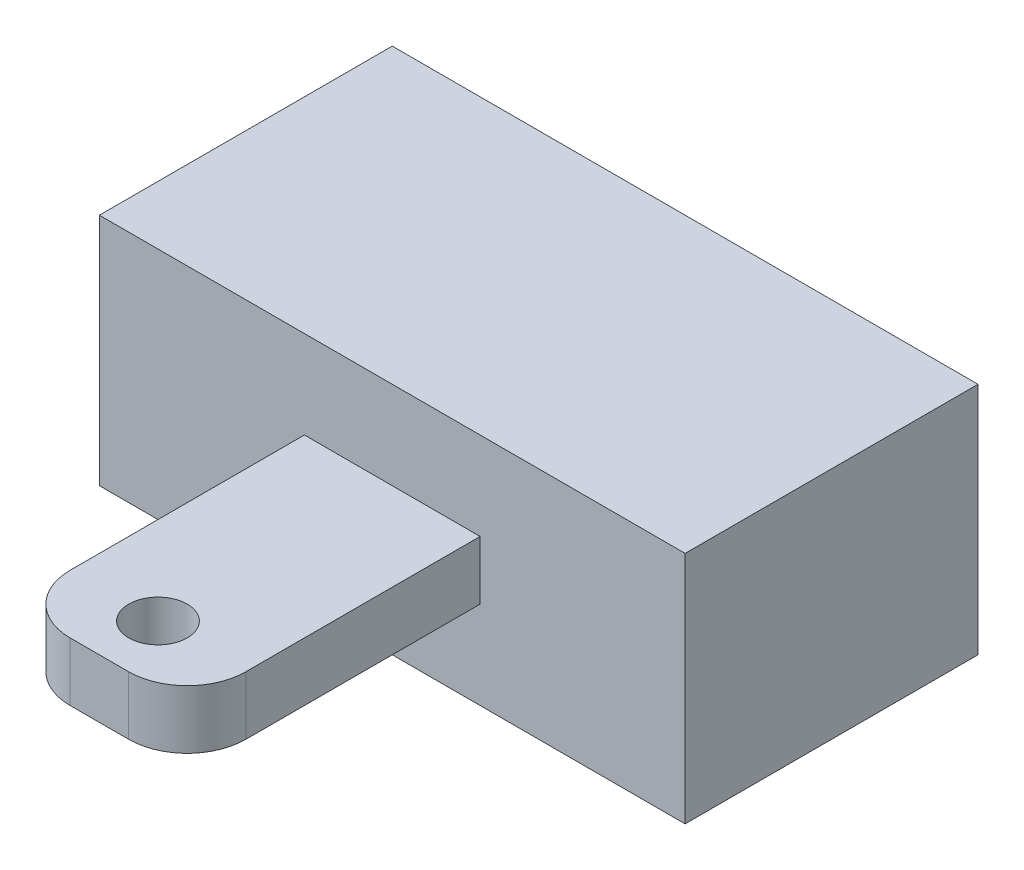
ISO-10303-21;
HEADER;
FILE_DESCRIPTION(('STEP AP214'),'2;1');
FILE_NAME('part.step','',(''),(''),'','','');
FILE_SCHEMA(('AUTOMOTIVE_DESIGN { 1 0 10303 214 1 1 1 1 }'));
ENDSEC;
DATA;
#1=APPLICATION_CONTEXT('core data for automotive mechanical design processes');
#2=APPLICATION_PROTOCOL_DEFINITION('international standard','automotive_design',2000,#1);
#3=PRODUCT_CONTEXT('',#1,'mechanical');
#4=PRODUCT('Part','Part','',(#3));
#5=PRODUCT_RELATED_PRODUCT_CATEGORY('part','',(#4));
#6=PRODUCT_DEFINITION_FORMATION('','',#4);
#7=PRODUCT_DEFINITION_CONTEXT('part definition',#1,'design');
#8=PRODUCT_DEFINITION('design','',#6,#7);
#9=PRODUCT_DEFINITION_SHAPE('','',#8);
#10=(LENGTH_UNIT() NAMED_UNIT(*) SI_UNIT(.MILLI.,.METRE.));
#11=(NAMED_UNIT(*) PLANE_ANGLE_UNIT() SI_UNIT($,.RADIAN.));
#12=(NAMED_UNIT(*) SI_UNIT($,.STERADIAN.) SOLID_ANGLE_UNIT());
#13=UNCERTAINTY_MEASURE_WITH_UNIT(LENGTH_MEASURE(1.E-05),#10,'distance_accuracy_value','');
#14=(GEOMETRIC_REPRESENTATION_CONTEXT(3) GLOBAL_UNCERTAINTY_ASSIGNED_CONTEXT((#13)) GLOBAL_UNIT_ASSIGNED_CONTEXT((#10,
#11,#12)) REPRESENTATION_CONTEXT('',''));
#15=CARTESIAN_POINT('',(0.,0.,0.));
#16=DIRECTION('',(0.,0.,1.));
#17=DIRECTION('',(1.,0.,0.));
#18=AXIS2_PLACEMENT_3D('',#15,#16,#17);
#19=CARTESIAN_POINT('',(15.,10.,50.));
#20=DIRECTION('',(-1.,0.,0.));
#21=DIRECTION('',(0.,0.,1.));
#22=AXIS2_PLACEMENT_3D('',#19,#20,#21);
#23=PLANE('',#22);
#24=DIRECTION('',(0.,0.,-1.));
#25=VECTOR('',#24,1.);
#26=CARTESIAN_POINT('',(15.,10.,50.));
#27=LINE('',#26,#25);
#28=CARTESIAN_POINT('',(15.,10.,40.));
#29=VERTEX_POINT('',#28);
#30=CARTESIAN_POINT('',(15.,10.,0.));
#31=VERTEX_POINT('',#30);
#32=EDGE_CURVE('E175',#29,#31,#27,.T.);
#33=ORIENTED_EDGE('',*,*,#32,.F.);
#34=DIRECTION('',(0.,-1.,0.));
#35=VECTOR('',#34,1.);
#36=CARTESIAN_POINT('',(15.,10.,40.));
#37=LINE('',#36,#35);
#38=CARTESIAN_POINT('',(15.,0.,40.));
#39=VERTEX_POINT('',#38);
#40=EDGE_CURVE('E189',#29,#39,#37,.T.);
#41=ORIENTED_EDGE('',*,*,#40,.T.);
#42=DIRECTION('',(0.,0.,-1.));
#43=VECTOR('',#42,1.);
#44=CARTESIAN_POINT('',(15.,0.,50.));
#45=LINE('',#44,#43);
#46=CARTESIAN_POINT('',(15.,0.,0.));
#47=VERTEX_POINT('',#46);
#48=EDGE_CURVE('E172',#39,#47,#45,.T.);
#49=ORIENTED_EDGE('',*,*,#48,.T.);
#50=DIRECTION('',(0.,1.,0.));
#51=VECTOR('',#50,1.);
#52=CARTESIAN_POINT('',(15.,10.,0.));
#53=LINE('',#52,#51);
#54=EDGE_CURVE('E163',#47,#31,#53,.T.);
#55=ORIENTED_EDGE('',*,*,#54,.T.);
#56=EDGE_LOOP('',(#33,#41,#49,#55));
#57=FACE_BOUND('',#56,.T.);
#58=ADVANCED_FACE('F38',(#57),#23,.F.);
#59=CARTESIAN_POINT('',(-15.,10.,50.));
#60=DIRECTION('',(1.,0.,0.));
#61=DIRECTION('',(0.,0.,-1.));
#62=AXIS2_PLACEMENT_3D('',#59,#60,#61);
#63=PLANE('',#62);
#64=DIRECTION('',(0.,0.,1.));
#65=VECTOR('',#64,1.);
#66=CARTESIAN_POINT('',(-15.,0.,50.));
#67=LINE('',#66,#65);
#68=CARTESIAN_POINT('',(-15.,0.,0.));
#69=VERTEX_POINT('',#68);
#70=CARTESIAN_POINT('',(-15.,0.,40.));
#71=VERTEX_POINT('',#70);
#72=EDGE_CURVE('E184',#69,#71,#67,.T.);
#73=ORIENTED_EDGE('',*,*,#72,.T.);
#74=DIRECTION('',(0.,-1.,0.));
#75=VECTOR('',#74,1.);
#76=CARTESIAN_POINT('',(-15.,10.,40.));
#77=LINE('',#76,#75);
#78=CARTESIAN_POINT('',(-15.,10.,40.));
#79=VERTEX_POINT('',#78);
#80=EDGE_CURVE('E11',#71,#79,#77,.F.);
#81=ORIENTED_EDGE('',*,*,#80,.T.);
#82=DIRECTION('',(0.,0.,1.));
#83=VECTOR('',#82,1.);
#84=CARTESIAN_POINT('',(-15.,10.,50.));
#85=LINE('',#84,#83);
#86=CARTESIAN_POINT('',(-15.,10.,0.));
#87=VERTEX_POINT('',#86);
#88=EDGE_CURVE('E177',#87,#79,#85,.T.);
#89=ORIENTED_EDGE('',*,*,#88,.F.);
#90=DIRECTION('',(0.,-1.,0.));
#91=VECTOR('',#90,1.);
#92=CARTESIAN_POINT('',(-15.,10.,0.));
#93=LINE('',#92,#91);
#94=EDGE_CURVE('E157',#87,#69,#93,.T.);
#95=ORIENTED_EDGE('',*,*,#94,.T.);
#96=EDGE_LOOP('',(#73,#81,#89,#95));
#97=FACE_BOUND('',#96,.T.);
#98=ADVANCED_FACE('F221',(#97),#63,.F.);
#99=CARTESIAN_POINT('',(-15.,10.,50.));
#100=DIRECTION('',(0.,0.,-1.));
#101=DIRECTION('',(-1.,0.,0.));
#102=AXIS2_PLACEMENT_3D('',#99,#100,#101);
#103=PLANE('',#102);
#104=DIRECTION('',(1.,0.,0.));
#105=VECTOR('',#104,1.);
#106=CARTESIAN_POINT('',(-15.,0.,50.));
#107=LINE('',#106,#105);
#108=CARTESIAN_POINT('',(-5.,0.,50.));
#109=VERTEX_POINT('',#108);
#110=CARTESIAN_POINT('',(5.,0.,50.));
#111=VERTEX_POINT('',#110);
#112=EDGE_CURVE('E178',#109,#111,#107,.T.);
#113=ORIENTED_EDGE('',*,*,#112,.T.);
#114=DIRECTION('',(0.,-1.,0.));
#115=VECTOR('',#114,1.);
#116=CARTESIAN_POINT('',(5.,10.,50.));
#117=LINE('',#116,#115);
#118=CARTESIAN_POINT('',(5.,10.,50.));
#119=VERTEX_POINT('',#118);
#120=EDGE_CURVE('E59',#111,#119,#117,.F.);
#121=ORIENTED_EDGE('',*,*,#120,.T.);
#122=DIRECTION('',(1.,0.,0.));
#123=VECTOR('',#122,1.);
#124=CARTESIAN_POINT('',(-15.,10.,50.));
#125=LINE('',#124,#123);
#126=CARTESIAN_POINT('',(-5.,10.,50.));
#127=VERTEX_POINT('',#126);
#128=EDGE_CURVE('E180',#127,#119,#125,.T.);
#129=ORIENTED_EDGE('',*,*,#128,.F.);
#130=DIRECTION('',(0.,-1.,0.));
#131=VECTOR('',#130,1.);
#132=CARTESIAN_POINT('',(-5.,10.,50.));
#133=LINE('',#132,#131);
#134=EDGE_CURVE('E196',#127,#109,#133,.T.);
#135=ORIENTED_EDGE('',*,*,#134,.T.);
#136=EDGE_LOOP('',(#113,#121,#129,#135));
#137=FACE_BOUND('',#136,.T.);
#138=ADVANCED_FACE('F217',(#137),#103,.F.);
#139=CARTESIAN_POINT('',(0.,10.,0.));
#140=DIRECTION('',(0.,-1.,0.));
#141=DIRECTION('',(0.,0.,-1.));
#142=AXIS2_PLACEMENT_3D('',#139,#140,#141);
#143=PLANE('',#142);
#144=CARTESIAN_POINT('',(0.,10.,40.));
#145=DIRECTION('',(0.,1.,0.));
#146=DIRECTION('',(0.,0.,1.));
#147=AXIS2_PLACEMENT_3D('',#144,#145,#146);
#148=CIRCLE('',#147,5.);
#149=CARTESIAN_POINT('',(0.,10.,45.));
#150=VERTEX_POINT('',#149);
#151=EDGE_CURVE('E168',#150,#150,#148,.T.);
#152=ORIENTED_EDGE('',*,*,#151,.F.);
#153=EDGE_LOOP('',(#152));
#154=FACE_BOUND('',#153,.T.);
#155=ORIENTED_EDGE('',*,*,#128,.T.);
#156=CARTESIAN_POINT('',(5.,10.,40.));
#157=DIRECTION('',(0.,-1.,0.));
#158=DIRECTION('',(0.,0.,-1.));
#159=AXIS2_PLACEMENT_3D('',#156,#157,#158);
#160=CIRCLE('',#159,10.);
#161=EDGE_CURVE('E46',#119,#29,#160,.F.);
#162=ORIENTED_EDGE('',*,*,#161,.T.);
#163=ORIENTED_EDGE('',*,*,#32,.T.);
#164=DIRECTION('',(-1.,0.,0.));
#165=VECTOR('',#164,1.);
#166=CARTESIAN_POINT('',(0.,10.,0.));
#167=LINE('',#166,#165);
#168=EDGE_CURVE('E166',#31,#87,#167,.T.);
#169=ORIENTED_EDGE('',*,*,#168,.T.);
#170=ORIENTED_EDGE('',*,*,#88,.T.);
#171=CARTESIAN_POINT('',(-5.,10.,40.));
#172=DIRECTION('',(0.,-1.,0.));
#173=DIRECTION('',(0.,0.,-1.));
#174=AXIS2_PLACEMENT_3D('',#171,#172,#173);
#175=CIRCLE('',#174,10.);
#176=EDGE_CURVE('E200',#79,#127,#175,.F.);
#177=ORIENTED_EDGE('',*,*,#176,.T.);
#178=EDGE_LOOP('',(#155,#162,#163,#169,#170,#177));
#179=FACE_BOUND('',#178,.T.);
#180=ADVANCED_FACE('F204',(#154,#179),#143,.F.);
#181=CARTESIAN_POINT('',(0.,0.,0.));
#182=DIRECTION('',(0.,-1.,0.));
#183=DIRECTION('',(0.,0.,-1.));
#184=AXIS2_PLACEMENT_3D('',#181,#182,#183);
#185=PLANE('',#184);
#186=ORIENTED_EDGE('',*,*,#48,.F.);
#187=CARTESIAN_POINT('',(5.,0.,40.));
#188=DIRECTION('',(0.,-1.,0.));
#189=DIRECTION('',(0.,0.,-1.));
#190=AXIS2_PLACEMENT_3D('',#187,#188,#189);
#191=CIRCLE('',#190,10.);
#192=EDGE_CURVE('E194',#39,#111,#191,.T.);
#193=ORIENTED_EDGE('',*,*,#192,.T.);
#194=ORIENTED_EDGE('',*,*,#112,.F.);
#195=CARTESIAN_POINT('',(-5.,0.,40.));
#196=DIRECTION('',(0.,-1.,0.));
#197=DIRECTION('',(0.,0.,-1.));
#198=AXIS2_PLACEMENT_3D('',#195,#196,#197);
#199=CIRCLE('',#198,10.);
#200=EDGE_CURVE('E192',#109,#71,#199,.T.);
#201=ORIENTED_EDGE('',*,*,#200,.T.);
#202=ORIENTED_EDGE('',*,*,#72,.F.);
#203=DIRECTION('',(-1.,0.,0.));
#204=VECTOR('',#203,1.);
#205=CARTESIAN_POINT('',(0.,0.,0.));
#206=LINE('',#205,#204);
#207=EDGE_CURVE('E182',#47,#69,#206,.T.);
#208=ORIENTED_EDGE('',*,*,#207,.F.);
#209=EDGE_LOOP('',(#186,#193,#194,#201,#202,#208));
#210=FACE_BOUND('',#209,.T.);
#211=CARTESIAN_POINT('',(0.,0.,40.));
#212=DIRECTION('',(0.,1.,0.));
#213=DIRECTION('',(0.,0.,1.));
#214=AXIS2_PLACEMENT_3D('',#211,#212,#213);
#215=CIRCLE('',#214,5.);
#216=CARTESIAN_POINT('',(0.,0.,45.));
#217=VERTEX_POINT('',#216);
#218=EDGE_CURVE('E169',#217,#217,#215,.T.);
#219=ORIENTED_EDGE('',*,*,#218,.T.);
#220=EDGE_LOOP('',(#219));
#221=FACE_BOUND('',#220,.T.);
#222=ADVANCED_FACE('F214',(#210,#221),#185,.T.);
#223=CARTESIAN_POINT('',(0.,0.,40.));
#224=DIRECTION('',(0.,1.,0.));
#225=DIRECTION('',(0.,0.,1.));
#226=AXIS2_PLACEMENT_3D('',#223,#224,#225);
#227=CYLINDRICAL_SURFACE('',#226,5.);
#228=ORIENTED_EDGE('',*,*,#218,.F.);
#229=EDGE_LOOP('',(#228));
#230=FACE_BOUND('',#229,.T.);
#231=ORIENTED_EDGE('',*,*,#151,.T.);
#232=EDGE_LOOP('',(#231));
#233=FACE_BOUND('',#232,.T.);
#234=ADVANCED_FACE('F224',(#230,#233),#227,.F.);
#235=CARTESIAN_POINT('',(0.,0.,0.));
#236=DIRECTION('',(0.,0.,1.));
#237=DIRECTION('',(1.,0.,0.));
#238=AXIS2_PLACEMENT_3D('',#235,#236,#237);
#239=PLANE('',#238);
#240=DIRECTION('',(0.,1.,0.));
#241=VECTOR('',#240,1.);
#242=CARTESIAN_POINT('',(-50.,-15.,0.));
#243=LINE('',#242,#241);
#244=CARTESIAN_POINT('',(-50.,-15.,0.));
#245=VERTEX_POINT('',#244);
#246=CARTESIAN_POINT('',(-50.,25.,0.));
#247=VERTEX_POINT('',#246);
#248=EDGE_CURVE('E136',#245,#247,#243,.T.);
#249=ORIENTED_EDGE('',*,*,#248,.F.);
#250=DIRECTION('',(-1.,0.,0.));
#251=VECTOR('',#250,1.);
#252=CARTESIAN_POINT('',(50.,-15.,0.));
#253=LINE('',#252,#251);
#254=CARTESIAN_POINT('',(50.,-15.,0.));
#255=VERTEX_POINT('',#254);
#256=EDGE_CURVE('E128',#255,#245,#253,.T.);
#257=ORIENTED_EDGE('',*,*,#256,.F.);
#258=DIRECTION('',(0.,-1.,0.));
#259=VECTOR('',#258,1.);
#260=CARTESIAN_POINT('',(50.,-15.,0.));
#261=LINE('',#260,#259);
#262=CARTESIAN_POINT('',(50.,25.,0.));
#263=VERTEX_POINT('',#262);
#264=EDGE_CURVE('E139',#263,#255,#261,.T.);
#265=ORIENTED_EDGE('',*,*,#264,.F.);
#266=DIRECTION('',(1.,0.,0.));
#267=VECTOR('',#266,1.);
#268=CARTESIAN_POINT('',(50.,25.,0.));
#269=LINE('',#268,#267);
#270=EDGE_CURVE('E120',#247,#263,#269,.T.);
#271=ORIENTED_EDGE('',*,*,#270,.F.);
#272=EDGE_LOOP('',(#249,#257,#265,#271));
#273=FACE_BOUND('',#272,.T.);
#274=ORIENTED_EDGE('',*,*,#168,.F.);
#275=ORIENTED_EDGE('',*,*,#54,.F.);
#276=ORIENTED_EDGE('',*,*,#207,.T.);
#277=ORIENTED_EDGE('',*,*,#94,.F.);
#278=EDGE_LOOP('',(#274,#275,#276,#277));
#279=FACE_BOUND('',#278,.T.);
#280=ADVANCED_FACE('F133',(#273,#279),#239,.T.);
#281=CARTESIAN_POINT('',(-50.,-15.,0.));
#282=DIRECTION('',(-1.,0.,0.));
#283=DIRECTION('',(0.,0.,1.));
#284=AXIS2_PLACEMENT_3D('',#281,#282,#283);
#285=PLANE('',#284);
#286=DIRECTION('',(0.,1.,0.));
#287=VECTOR('',#286,1.);
#288=CARTESIAN_POINT('',(-50.,-15.,-50.));
#289=LINE('',#288,#287);
#290=CARTESIAN_POINT('',(-50.,-15.,-50.));
#291=VERTEX_POINT('',#290);
#292=CARTESIAN_POINT('',(-50.,25.,-50.));
#293=VERTEX_POINT('',#292);
#294=EDGE_CURVE('E151',#291,#293,#289,.T.);
#295=ORIENTED_EDGE('',*,*,#294,.F.);
#296=DIRECTION('',(0.,0.,-1.));
#297=VECTOR('',#296,1.);
#298=CARTESIAN_POINT('',(-50.,-15.,0.));
#299=LINE('',#298,#297);
#300=EDGE_CURVE('E142',#245,#291,#299,.T.);
#301=ORIENTED_EDGE('',*,*,#300,.F.);
#302=ORIENTED_EDGE('',*,*,#248,.T.);
#303=DIRECTION('',(0.,0.,-1.));
#304=VECTOR('',#303,1.);
#305=CARTESIAN_POINT('',(-50.,25.,0.));
#306=LINE('',#305,#304);
#307=EDGE_CURVE('E117',#247,#293,#306,.T.);
#308=ORIENTED_EDGE('',*,*,#307,.T.);
#309=EDGE_LOOP('',(#295,#301,#302,#308));
#310=FACE_BOUND('',#309,.T.);
#311=ADVANCED_FACE('F141',(#310),#285,.T.);
#312=CARTESIAN_POINT('',(50.,-15.,0.));
#313=DIRECTION('',(0.,-1.,0.));
#314=DIRECTION('',(0.,0.,-1.));
#315=AXIS2_PLACEMENT_3D('',#312,#313,#314);
#316=PLANE('',#315);
#317=DIRECTION('',(-1.,0.,0.));
#318=VECTOR('',#317,1.);
#319=CARTESIAN_POINT('',(50.,-15.,-50.));
#320=LINE('',#319,#318);
#321=CARTESIAN_POINT('',(50.,-15.,-50.));
#322=VERTEX_POINT('',#321);
#323=EDGE_CURVE('E143',#322,#291,#320,.T.);
#324=ORIENTED_EDGE('',*,*,#323,.F.);
#325=DIRECTION('',(0.,0.,-1.));
#326=VECTOR('',#325,1.);
#327=CARTESIAN_POINT('',(50.,-15.,0.));
#328=LINE('',#327,#326);
#329=EDGE_CURVE('E158',#255,#322,#328,.T.);
#330=ORIENTED_EDGE('',*,*,#329,.F.);
#331=ORIENTED_EDGE('',*,*,#256,.T.);
#332=ORIENTED_EDGE('',*,*,#300,.T.);
#333=EDGE_LOOP('',(#324,#330,#331,#332));
#334=FACE_BOUND('',#333,.T.);
#335=ADVANCED_FACE('F230',(#334),#316,.T.);
#336=CARTESIAN_POINT('',(50.,-15.,0.));
#337=DIRECTION('',(1.,0.,0.));
#338=DIRECTION('',(0.,0.,-1.));
#339=AXIS2_PLACEMENT_3D('',#336,#337,#338);
#340=PLANE('',#339);
#341=DIRECTION('',(0.,-1.,0.));
#342=VECTOR('',#341,1.);
#343=CARTESIAN_POINT('',(50.,-15.,-50.));
#344=LINE('',#343,#342);
#345=CARTESIAN_POINT('',(50.,25.,-50.));
#346=VERTEX_POINT('',#345);
#347=EDGE_CURVE('E146',#346,#322,#344,.T.);
#348=ORIENTED_EDGE('',*,*,#347,.F.);
#349=DIRECTION('',(0.,0.,-1.));
#350=VECTOR('',#349,1.);
#351=CARTESIAN_POINT('',(50.,25.,0.));
#352=LINE('',#351,#350);
#353=EDGE_CURVE('E127',#263,#346,#352,.T.);
#354=ORIENTED_EDGE('',*,*,#353,.F.);
#355=ORIENTED_EDGE('',*,*,#264,.T.);
#356=ORIENTED_EDGE('',*,*,#329,.T.);
#357=EDGE_LOOP('',(#348,#354,#355,#356));
#358=FACE_BOUND('',#357,.T.);
#359=ADVANCED_FACE('F252',(#358),#340,.T.);
#360=CARTESIAN_POINT('',(50.,25.,0.));
#361=DIRECTION('',(0.,1.,0.));
#362=DIRECTION('',(0.,0.,1.));
#363=AXIS2_PLACEMENT_3D('',#360,#361,#362);
#364=PLANE('',#363);
#365=DIRECTION('',(1.,0.,0.));
#366=VECTOR('',#365,1.);
#367=CARTESIAN_POINT('',(50.,25.,-50.));
#368=LINE('',#367,#366);
#369=EDGE_CURVE('E122',#293,#346,#368,.T.);
#370=ORIENTED_EDGE('',*,*,#369,.F.);
#371=ORIENTED_EDGE('',*,*,#307,.F.);
#372=ORIENTED_EDGE('',*,*,#270,.T.);
#373=ORIENTED_EDGE('',*,*,#353,.T.);
#374=EDGE_LOOP('',(#370,#371,#372,#373));
#375=FACE_BOUND('',#374,.T.);
#376=ADVANCED_FACE('F119',(#375),#364,.T.);
#377=CARTESIAN_POINT('',(-15.,10.,-50.));
#378=DIRECTION('',(0.,0.,1.));
#379=DIRECTION('',(1.,0.,0.));
#380=AXIS2_PLACEMENT_3D('',#377,#378,#379);
#381=PLANE('',#380);
#382=ORIENTED_EDGE('',*,*,#294,.T.);
#383=ORIENTED_EDGE('',*,*,#369,.T.);
#384=ORIENTED_EDGE('',*,*,#347,.T.);
#385=ORIENTED_EDGE('',*,*,#323,.T.);
#386=EDGE_LOOP('',(#382,#383,#384,#385));
#387=FACE_BOUND('',#386,.T.);
#388=ADVANCED_FACE('F242',(#387),#381,.F.);
#389=CARTESIAN_POINT('',(5.,10.,40.));
#390=DIRECTION('',(0.,-1.,0.));
#391=DIRECTION('',(0.,0.,-1.));
#392=AXIS2_PLACEMENT_3D('',#389,#390,#391);
#393=CYLINDRICAL_SURFACE('',#392,10.);
#394=ORIENTED_EDGE('',*,*,#161,.F.);
#395=ORIENTED_EDGE('',*,*,#120,.F.);
#396=ORIENTED_EDGE('',*,*,#192,.F.);
#397=ORIENTED_EDGE('',*,*,#40,.F.);
#398=EDGE_LOOP('',(#394,#395,#396,#397));
#399=FACE_BOUND('',#398,.T.);
#400=ADVANCED_FACE('F211',(#399),#393,.T.);
#401=CARTESIAN_POINT('',(-5.,10.,40.));
#402=DIRECTION('',(0.,-1.,0.));
#403=DIRECTION('',(0.,0.,-1.));
#404=AXIS2_PLACEMENT_3D('',#401,#402,#403);
#405=CYLINDRICAL_SURFACE('',#404,10.);
#406=ORIENTED_EDGE('',*,*,#176,.F.);
#407=ORIENTED_EDGE('',*,*,#80,.F.);
#408=ORIENTED_EDGE('',*,*,#200,.F.);
#409=ORIENTED_EDGE('',*,*,#134,.F.);
#410=EDGE_LOOP('',(#406,#407,#408,#409));
#411=FACE_BOUND('',#410,.T.);
#412=ADVANCED_FACE('F40',(#411),#405,.T.);
#413=CLOSED_SHELL('',(#58,#98,#138,#180,#222,#234,#280,#311,#335,#359,#376,#388,#400,#412));
#414=MANIFOLD_SOLID_BREP('B2',#413);
#415=ADVANCED_BREP_SHAPE_REPRESENTATION('',(#18,#414),#14);
#416=SHAPE_DEFINITION_REPRESENTATION(#9,#415);
ENDSEC;
END-ISO-10303-21;
